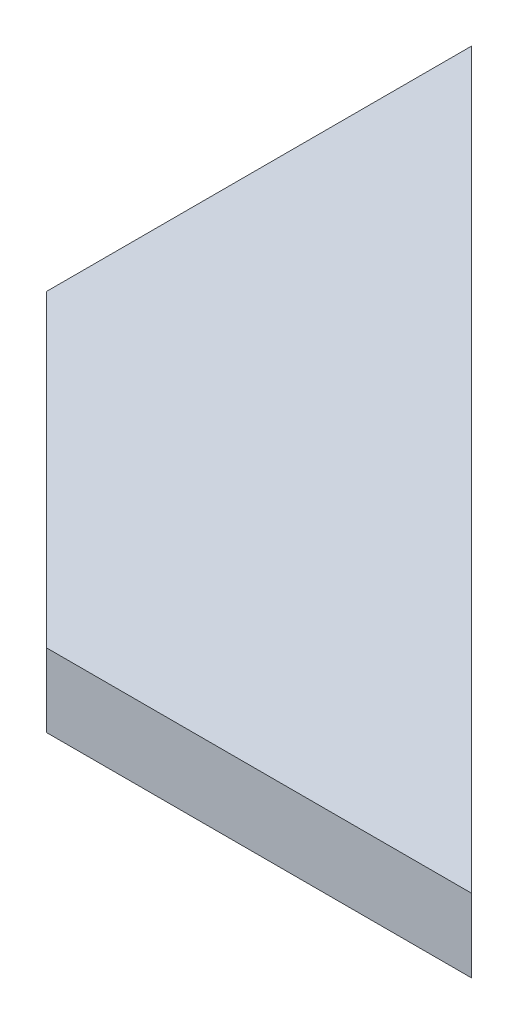
ISO-10303-21;
HEADER;
FILE_DESCRIPTION(('STEP AP214'),'2;1');
FILE_NAME('part.step','',(''),(''),'','','');
FILE_SCHEMA(('AUTOMOTIVE_DESIGN { 1 0 10303 214 1 1 1 1 }'));
ENDSEC;
DATA;
#1=APPLICATION_CONTEXT('core data for automotive mechanical design processes');
#2=APPLICATION_PROTOCOL_DEFINITION('international standard','automotive_design',2000,#1);
#3=PRODUCT_CONTEXT('',#1,'mechanical');
#4=PRODUCT('Part','Part','',(#3));
#5=PRODUCT_RELATED_PRODUCT_CATEGORY('part','',(#4));
#6=PRODUCT_DEFINITION_FORMATION('','',#4);
#7=PRODUCT_DEFINITION_CONTEXT('part definition',#1,'design');
#8=PRODUCT_DEFINITION('design','',#6,#7);
#9=PRODUCT_DEFINITION_SHAPE('','',#8);
#10=(LENGTH_UNIT() NAMED_UNIT(*) SI_UNIT(.MILLI.,.METRE.));
#11=(NAMED_UNIT(*) PLANE_ANGLE_UNIT() SI_UNIT($,.RADIAN.));
#12=(NAMED_UNIT(*) SI_UNIT($,.STERADIAN.) SOLID_ANGLE_UNIT());
#13=UNCERTAINTY_MEASURE_WITH_UNIT(LENGTH_MEASURE(1.E-05),#10,'distance_accuracy_value','');
#14=(GEOMETRIC_REPRESENTATION_CONTEXT(3) GLOBAL_UNCERTAINTY_ASSIGNED_CONTEXT((#13)) GLOBAL_UNIT_ASSIGNED_CONTEXT((#10,
#11,#12)) REPRESENTATION_CONTEXT('',''));
#15=CARTESIAN_POINT('',(0.,0.,0.));
#16=DIRECTION('',(0.,0.,1.));
#17=DIRECTION('',(1.,0.,0.));
#18=AXIS2_PLACEMENT_3D('',#15,#16,#17);
#19=CARTESIAN_POINT('',(0.,10.,0.));
#20=DIRECTION('',(0.,0.,-1.));
#21=DIRECTION('',(-1.,0.,0.));
#22=AXIS2_PLACEMENT_3D('',#19,#20,#21);
#23=PLANE('',#22);
#24=DIRECTION('',(1.,0.,0.));
#25=VECTOR('',#24,1.);
#26=CARTESIAN_POINT('',(0.,-10.,0.));
#27=LINE('',#26,#25);
#28=CARTESIAN_POINT('',(84.0821569520328,-10.,0.));
#29=VERTEX_POINT('',#28);
#30=CARTESIAN_POINT('',(200.,-10.,0.));
#31=VERTEX_POINT('',#30);
#32=EDGE_CURVE('E95',#29,#31,#27,.T.);
#33=ORIENTED_EDGE('',*,*,#32,.T.);
#34=DIRECTION('',(0.,-1.,0.));
#35=VECTOR('',#34,1.);
#36=CARTESIAN_POINT('',(200.,10.,0.));
#37=LINE('',#36,#35);
#38=CARTESIAN_POINT('',(200.,10.,0.));
#39=VERTEX_POINT('',#38);
#40=EDGE_CURVE('E11',#39,#31,#37,.T.);
#41=ORIENTED_EDGE('',*,*,#40,.F.);
#42=DIRECTION('',(1.,0.,0.));
#43=VECTOR('',#42,1.);
#44=CARTESIAN_POINT('',(0.,10.,0.));
#45=LINE('',#44,#43);
#46=CARTESIAN_POINT('',(84.0821569520328,10.,0.));
#47=VERTEX_POINT('',#46);
#48=EDGE_CURVE('E80',#47,#39,#45,.T.);
#49=ORIENTED_EDGE('',*,*,#48,.F.);
#50=DIRECTION('',(0.,-1.,0.));
#51=VECTOR('',#50,1.);
#52=CARTESIAN_POINT('',(84.0821569520328,10.,0.));
#53=LINE('',#52,#51);
#54=EDGE_CURVE('E91',#47,#29,#53,.T.);
#55=ORIENTED_EDGE('',*,*,#54,.T.);
#56=EDGE_LOOP('',(#33,#41,#49,#55));
#57=FACE_BOUND('',#56,.T.);
#58=ADVANCED_FACE('F33',(#57),#23,.F.);
#59=CARTESIAN_POINT('',(100.,10.,-100.));
#60=DIRECTION('',(-0.707106781186548,0.,0.707106781186548));
#61=DIRECTION('',(0.707106781186548,0.,0.707106781186548));
#62=AXIS2_PLACEMENT_3D('',#59,#60,#61);
#63=PLANE('',#62);
#64=DIRECTION('',(-0.707106781186548,0.,-0.707106781186548));
#65=VECTOR('',#64,1.);
#66=CARTESIAN_POINT('',(100.,-10.,-100.));
#67=LINE('',#66,#65);
#68=CARTESIAN_POINT('',(0.,-10.,-200.));
#69=VERTEX_POINT('',#68);
#70=EDGE_CURVE('E85',#31,#69,#67,.T.);
#71=ORIENTED_EDGE('',*,*,#70,.T.);
#72=DIRECTION('',(0.,-1.,0.));
#73=VECTOR('',#72,1.);
#74=CARTESIAN_POINT('',(0.,10.,-200.));
#75=LINE('',#74,#73);
#76=CARTESIAN_POINT('',(0.,10.,-200.));
#77=VERTEX_POINT('',#76);
#78=EDGE_CURVE('E41',#77,#69,#75,.T.);
#79=ORIENTED_EDGE('',*,*,#78,.F.);
#80=DIRECTION('',(-0.707106781186548,0.,-0.707106781186548));
#81=VECTOR('',#80,1.);
#82=CARTESIAN_POINT('',(100.,10.,-100.));
#83=LINE('',#82,#81);
#84=EDGE_CURVE('E75',#39,#77,#83,.T.);
#85=ORIENTED_EDGE('',*,*,#84,.F.);
#86=ORIENTED_EDGE('',*,*,#40,.T.);
#87=EDGE_LOOP('',(#71,#79,#85,#86));
#88=FACE_BOUND('',#87,.T.);
#89=ADVANCED_FACE('F84',(#88),#63,.F.);
#90=CARTESIAN_POINT('',(0.,10.,0.));
#91=DIRECTION('',(-1.,0.,0.));
#92=DIRECTION('',(0.,0.,1.));
#93=AXIS2_PLACEMENT_3D('',#90,#91,#92);
#94=PLANE('',#93);
#95=DIRECTION('',(0.,0.,-1.));
#96=VECTOR('',#95,1.);
#97=CARTESIAN_POINT('',(0.,-10.,0.));
#98=LINE('',#97,#96);
#99=CARTESIAN_POINT('',(0.,-10.,-84.0821569520328));
#100=VERTEX_POINT('',#99);
#101=EDGE_CURVE('E99',#100,#69,#98,.T.);
#102=ORIENTED_EDGE('',*,*,#101,.F.);
#103=DIRECTION('',(0.,-1.,0.));
#104=VECTOR('',#103,1.);
#105=CARTESIAN_POINT('',(0.,10.,-84.0821569520328));
#106=LINE('',#105,#104);
#107=CARTESIAN_POINT('',(0.,10.,-84.0821569520328));
#108=VERTEX_POINT('',#107);
#109=EDGE_CURVE('E65',#108,#100,#106,.T.);
#110=ORIENTED_EDGE('',*,*,#109,.F.);
#111=DIRECTION('',(0.,0.,-1.));
#112=VECTOR('',#111,1.);
#113=CARTESIAN_POINT('',(0.,10.,0.));
#114=LINE('',#113,#112);
#115=EDGE_CURVE('E78',#108,#77,#114,.T.);
#116=ORIENTED_EDGE('',*,*,#115,.T.);
#117=ORIENTED_EDGE('',*,*,#78,.T.);
#118=EDGE_LOOP('',(#102,#110,#116,#117));
#119=FACE_BOUND('',#118,.T.);
#120=ADVANCED_FACE('F89',(#119),#94,.T.);
#121=CARTESIAN_POINT('',(42.0410784760164,10.,-42.0410784760164));
#122=DIRECTION('',(0.707106781186548,0.,-0.707106781186548));
#123=DIRECTION('',(-0.707106781186548,0.,-0.707106781186548));
#124=AXIS2_PLACEMENT_3D('',#121,#122,#123);
#125=PLANE('',#124);
#126=DIRECTION('',(0.707106781186548,0.,0.707106781186548));
#127=VECTOR('',#126,1.);
#128=CARTESIAN_POINT('',(42.0410784760164,-10.,-42.0410784760164));
#129=LINE('',#128,#127);
#130=EDGE_CURVE('E68',#100,#29,#129,.T.);
#131=ORIENTED_EDGE('',*,*,#130,.T.);
#132=ORIENTED_EDGE('',*,*,#54,.F.);
#133=DIRECTION('',(0.707106781186548,0.,0.707106781186548));
#134=VECTOR('',#133,1.);
#135=CARTESIAN_POINT('',(42.0410784760164,10.,-42.0410784760164));
#136=LINE('',#135,#134);
#137=EDGE_CURVE('E49',#108,#47,#136,.T.);
#138=ORIENTED_EDGE('',*,*,#137,.F.);
#139=ORIENTED_EDGE('',*,*,#109,.T.);
#140=EDGE_LOOP('',(#131,#132,#138,#139));
#141=FACE_BOUND('',#140,.T.);
#142=ADVANCED_FACE('F112',(#141),#125,.F.);
#143=CARTESIAN_POINT('',(0.,10.,0.));
#144=DIRECTION('',(0.,1.,0.));
#145=DIRECTION('',(0.,0.,1.));
#146=AXIS2_PLACEMENT_3D('',#143,#144,#145);
#147=PLANE('',#146);
#148=ORIENTED_EDGE('',*,*,#48,.T.);
#149=ORIENTED_EDGE('',*,*,#84,.T.);
#150=ORIENTED_EDGE('',*,*,#115,.F.);
#151=ORIENTED_EDGE('',*,*,#137,.T.);
#152=EDGE_LOOP('',(#148,#149,#150,#151));
#153=FACE_BOUND('',#152,.T.);
#154=ADVANCED_FACE('F76',(#153),#147,.T.);
#155=CARTESIAN_POINT('',(0.,-10.,0.));
#156=DIRECTION('',(0.,1.,0.));
#157=DIRECTION('',(0.,0.,1.));
#158=AXIS2_PLACEMENT_3D('',#155,#156,#157);
#159=PLANE('',#158);
#160=ORIENTED_EDGE('',*,*,#32,.F.);
#161=ORIENTED_EDGE('',*,*,#130,.F.);
#162=ORIENTED_EDGE('',*,*,#101,.T.);
#163=ORIENTED_EDGE('',*,*,#70,.F.);
#164=EDGE_LOOP('',(#160,#161,#162,#163));
#165=FACE_BOUND('',#164,.T.);
#166=ADVANCED_FACE('F106',(#165),#159,.F.);
#167=CLOSED_SHELL('',(#58,#89,#120,#142,#154,#166));
#168=MANIFOLD_SOLID_BREP('B2',#167);
#169=ADVANCED_BREP_SHAPE_REPRESENTATION('',(#18,#168),#14);
#170=SHAPE_DEFINITION_REPRESENTATION(#9,#169);
ENDSEC;
END-ISO-10303-21;
